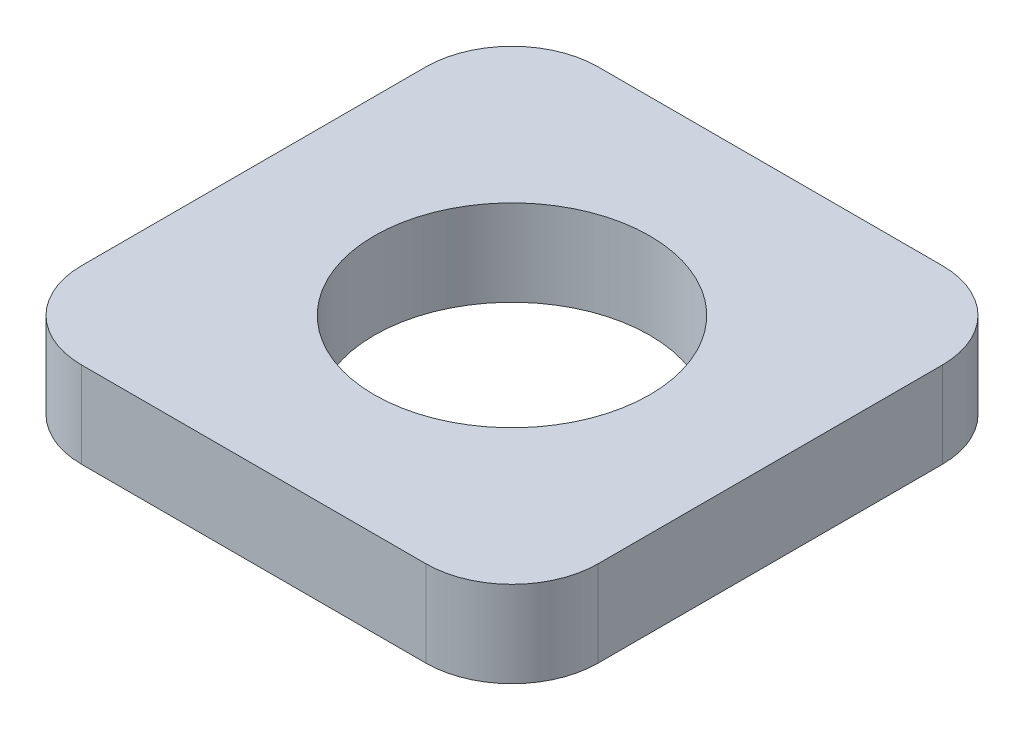
ISO-10303-21;
HEADER;
FILE_DESCRIPTION(('STEP AP214'),'2;1');
FILE_NAME('part.step','',(''),(''),'','','');
FILE_SCHEMA(('AUTOMOTIVE_DESIGN { 1 0 10303 214 1 1 1 1 }'));
ENDSEC;
DATA;
#1=APPLICATION_CONTEXT('core data for automotive mechanical design processes');
#2=APPLICATION_PROTOCOL_DEFINITION('international standard','automotive_design',2000,#1);
#3=PRODUCT_CONTEXT('',#1,'mechanical');
#4=PRODUCT('Part','Part','',(#3));
#5=PRODUCT_RELATED_PRODUCT_CATEGORY('part','',(#4));
#6=PRODUCT_DEFINITION_FORMATION('','',#4);
#7=PRODUCT_DEFINITION_CONTEXT('part definition',#1,'design');
#8=PRODUCT_DEFINITION('design','',#6,#7);
#9=PRODUCT_DEFINITION_SHAPE('','',#8);
#10=(LENGTH_UNIT() NAMED_UNIT(*) SI_UNIT(.MILLI.,.METRE.));
#11=(NAMED_UNIT(*) PLANE_ANGLE_UNIT() SI_UNIT($,.RADIAN.));
#12=(NAMED_UNIT(*) SI_UNIT($,.STERADIAN.) SOLID_ANGLE_UNIT());
#13=UNCERTAINTY_MEASURE_WITH_UNIT(LENGTH_MEASURE(1.E-05),#10,'distance_accuracy_value','');
#14=(GEOMETRIC_REPRESENTATION_CONTEXT(3) GLOBAL_UNCERTAINTY_ASSIGNED_CONTEXT((#13)) GLOBAL_UNIT_ASSIGNED_CONTEXT((#10,
#11,#12)) REPRESENTATION_CONTEXT('',''));
#15=CARTESIAN_POINT('',(0.,0.,0.));
#16=DIRECTION('',(0.,0.,1.));
#17=DIRECTION('',(1.,0.,0.));
#18=AXIS2_PLACEMENT_3D('',#15,#16,#17);
#19=CARTESIAN_POINT('',(2.,1.,-2.));
#20=DIRECTION('',(0.,1.,0.));
#21=DIRECTION('',(0.,0.,1.));
#22=AXIS2_PLACEMENT_3D('',#19,#20,#21);
#23=PLANE('',#22);
#24=CARTESIAN_POINT('',(2.,1.,-2.));
#25=DIRECTION('',(0.,1.,0.));
#26=DIRECTION('',(0.,0.,1.));
#27=AXIS2_PLACEMENT_3D('',#24,#25,#26);
#28=CIRCLE('',#27,1.);
#29=CARTESIAN_POINT('',(3.,1.,-2.));
#30=VERTEX_POINT('',#29);
#31=CARTESIAN_POINT('',(2.,1.,-3.));
#32=VERTEX_POINT('',#31);
#33=EDGE_CURVE('E145',#30,#32,#28,.T.);
#34=ORIENTED_EDGE('',*,*,#33,.T.);
#35=DIRECTION('',(-1.,0.,0.));
#36=VECTOR('',#35,1.);
#37=CARTESIAN_POINT('',(-2.,1.,-3.));
#38=LINE('',#37,#36);
#39=CARTESIAN_POINT('',(-2.,1.,-3.));
#40=VERTEX_POINT('',#39);
#41=EDGE_CURVE('E93',#32,#40,#38,.T.);
#42=ORIENTED_EDGE('',*,*,#41,.T.);
#43=CARTESIAN_POINT('',(-2.,1.,-2.));
#44=DIRECTION('',(0.,1.,0.));
#45=DIRECTION('',(0.,0.,1.));
#46=AXIS2_PLACEMENT_3D('',#43,#44,#45);
#47=CIRCLE('',#46,1.);
#48=CARTESIAN_POINT('',(-3.,1.,-2.));
#49=VERTEX_POINT('',#48);
#50=EDGE_CURVE('E160',#40,#49,#47,.T.);
#51=ORIENTED_EDGE('',*,*,#50,.T.);
#52=DIRECTION('',(0.,0.,1.));
#53=VECTOR('',#52,1.);
#54=CARTESIAN_POINT('',(-3.,1.,2.));
#55=LINE('',#54,#53);
#56=CARTESIAN_POINT('',(-3.,1.,2.));
#57=VERTEX_POINT('',#56);
#58=EDGE_CURVE('E173',#49,#57,#55,.T.);
#59=ORIENTED_EDGE('',*,*,#58,.T.);
#60=CARTESIAN_POINT('',(-2.,1.,2.));
#61=DIRECTION('',(0.,1.,0.));
#62=DIRECTION('',(0.,0.,-1.));
#63=AXIS2_PLACEMENT_3D('',#60,#61,#62);
#64=CIRCLE('',#63,1.);
#65=CARTESIAN_POINT('',(-2.,1.,3.));
#66=VERTEX_POINT('',#65);
#67=EDGE_CURVE('E112',#57,#66,#64,.T.);
#68=ORIENTED_EDGE('',*,*,#67,.T.);
#69=DIRECTION('',(1.,0.,0.));
#70=VECTOR('',#69,1.);
#71=CARTESIAN_POINT('',(-2.,1.,3.));
#72=LINE('',#71,#70);
#73=CARTESIAN_POINT('',(2.,1.,3.));
#74=VERTEX_POINT('',#73);
#75=EDGE_CURVE('E106',#66,#74,#72,.T.);
#76=ORIENTED_EDGE('',*,*,#75,.T.);
#77=CARTESIAN_POINT('',(2.,1.,2.));
#78=DIRECTION('',(0.,1.,0.));
#79=DIRECTION('',(0.,0.,-1.));
#80=AXIS2_PLACEMENT_3D('',#77,#78,#79);
#81=CIRCLE('',#80,1.);
#82=CARTESIAN_POINT('',(3.,1.,2.));
#83=VERTEX_POINT('',#82);
#84=EDGE_CURVE('E110',#74,#83,#81,.T.);
#85=ORIENTED_EDGE('',*,*,#84,.T.);
#86=DIRECTION('',(0.,0.,-1.));
#87=VECTOR('',#86,1.);
#88=CARTESIAN_POINT('',(3.,1.,2.));
#89=LINE('',#88,#87);
#90=EDGE_CURVE('E50',#83,#30,#89,.T.);
#91=ORIENTED_EDGE('',*,*,#90,.T.);
#92=EDGE_LOOP('',(#34,#42,#51,#59,#68,#76,#85,#91));
#93=FACE_BOUND('',#92,.T.);
#94=CARTESIAN_POINT('',(0.,1.,0.));
#95=DIRECTION('',(0.,1.,0.));
#96=DIRECTION('',(0.,0.,1.));
#97=AXIS2_PLACEMENT_3D('',#94,#95,#96);
#98=CIRCLE('',#97,1.6);
#99=CARTESIAN_POINT('',(0.,1.,1.6));
#100=VERTEX_POINT('',#99);
#101=EDGE_CURVE('E134',#100,#100,#98,.T.);
#102=ORIENTED_EDGE('',*,*,#101,.F.);
#103=EDGE_LOOP('',(#102));
#104=FACE_BOUND('',#103,.T.);
#105=ADVANCED_FACE('F33',(#93,#104),#23,.T.);
#106=CARTESIAN_POINT('',(2.,0.,-2.));
#107=DIRECTION('',(0.,1.,0.));
#108=DIRECTION('',(0.,0.,1.));
#109=AXIS2_PLACEMENT_3D('',#106,#107,#108);
#110=PLANE('',#109);
#111=CARTESIAN_POINT('',(2.,0.,-2.));
#112=DIRECTION('',(0.,1.,0.));
#113=DIRECTION('',(0.,0.,1.));
#114=AXIS2_PLACEMENT_3D('',#111,#112,#113);
#115=CIRCLE('',#114,1.);
#116=CARTESIAN_POINT('',(3.,0.,-2.));
#117=VERTEX_POINT('',#116);
#118=CARTESIAN_POINT('',(2.,0.,-3.));
#119=VERTEX_POINT('',#118);
#120=EDGE_CURVE('E130',#117,#119,#115,.T.);
#121=ORIENTED_EDGE('',*,*,#120,.F.);
#122=DIRECTION('',(0.,0.,-1.));
#123=VECTOR('',#122,1.);
#124=CARTESIAN_POINT('',(3.,0.,2.));
#125=LINE('',#124,#123);
#126=CARTESIAN_POINT('',(3.,0.,2.));
#127=VERTEX_POINT('',#126);
#128=EDGE_CURVE('E85',#127,#117,#125,.T.);
#129=ORIENTED_EDGE('',*,*,#128,.F.);
#130=CARTESIAN_POINT('',(2.,0.,2.));
#131=DIRECTION('',(0.,1.,0.));
#132=DIRECTION('',(0.,0.,-1.));
#133=AXIS2_PLACEMENT_3D('',#130,#131,#132);
#134=CIRCLE('',#133,1.);
#135=CARTESIAN_POINT('',(2.,0.,3.));
#136=VERTEX_POINT('',#135);
#137=EDGE_CURVE('E79',#136,#127,#134,.T.);
#138=ORIENTED_EDGE('',*,*,#137,.F.);
#139=DIRECTION('',(1.,0.,0.));
#140=VECTOR('',#139,1.);
#141=CARTESIAN_POINT('',(-2.,0.,3.));
#142=LINE('',#141,#140);
#143=CARTESIAN_POINT('',(-2.,0.,3.));
#144=VERTEX_POINT('',#143);
#145=EDGE_CURVE('E120',#144,#136,#142,.T.);
#146=ORIENTED_EDGE('',*,*,#145,.F.);
#147=CARTESIAN_POINT('',(-2.,0.,2.));
#148=DIRECTION('',(0.,1.,0.));
#149=DIRECTION('',(0.,0.,-1.));
#150=AXIS2_PLACEMENT_3D('',#147,#148,#149);
#151=CIRCLE('',#150,1.);
#152=CARTESIAN_POINT('',(-3.,0.,2.));
#153=VERTEX_POINT('',#152);
#154=EDGE_CURVE('E140',#153,#144,#151,.T.);
#155=ORIENTED_EDGE('',*,*,#154,.F.);
#156=DIRECTION('',(0.,0.,1.));
#157=VECTOR('',#156,1.);
#158=CARTESIAN_POINT('',(-3.,0.,2.));
#159=LINE('',#158,#157);
#160=CARTESIAN_POINT('',(-3.,0.,-2.));
#161=VERTEX_POINT('',#160);
#162=EDGE_CURVE('E138',#161,#153,#159,.T.);
#163=ORIENTED_EDGE('',*,*,#162,.F.);
#164=CARTESIAN_POINT('',(-2.,0.,-2.));
#165=DIRECTION('',(0.,1.,0.));
#166=DIRECTION('',(0.,0.,1.));
#167=AXIS2_PLACEMENT_3D('',#164,#165,#166);
#168=CIRCLE('',#167,1.);
#169=CARTESIAN_POINT('',(-2.,0.,-3.));
#170=VERTEX_POINT('',#169);
#171=EDGE_CURVE('E136',#170,#161,#168,.T.);
#172=ORIENTED_EDGE('',*,*,#171,.F.);
#173=DIRECTION('',(-1.,0.,0.));
#174=VECTOR('',#173,1.);
#175=CARTESIAN_POINT('',(-2.,0.,-3.));
#176=LINE('',#175,#174);
#177=EDGE_CURVE('E133',#119,#170,#176,.T.);
#178=ORIENTED_EDGE('',*,*,#177,.F.);
#179=EDGE_LOOP('',(#121,#129,#138,#146,#155,#163,#172,#178));
#180=FACE_BOUND('',#179,.T.);
#181=CARTESIAN_POINT('',(0.,0.,0.));
#182=DIRECTION('',(0.,1.,0.));
#183=DIRECTION('',(0.,0.,1.));
#184=AXIS2_PLACEMENT_3D('',#181,#182,#183);
#185=CIRCLE('',#184,1.6);
#186=CARTESIAN_POINT('',(0.,0.,1.6));
#187=VERTEX_POINT('',#186);
#188=EDGE_CURVE('E179',#187,#187,#185,.T.);
#189=ORIENTED_EDGE('',*,*,#188,.T.);
#190=EDGE_LOOP('',(#189));
#191=FACE_BOUND('',#190,.T.);
#192=ADVANCED_FACE('F164',(#180,#191),#110,.F.);
#193=CARTESIAN_POINT('',(2.,1.,-2.));
#194=DIRECTION('',(0.,-1.,0.));
#195=DIRECTION('',(0.,0.,-1.));
#196=AXIS2_PLACEMENT_3D('',#193,#194,#195);
#197=CYLINDRICAL_SURFACE('',#196,1.);
#198=ORIENTED_EDGE('',*,*,#120,.T.);
#199=DIRECTION('',(0.,-1.,0.));
#200=VECTOR('',#199,1.);
#201=CARTESIAN_POINT('',(2.,1.,-3.));
#202=LINE('',#201,#200);
#203=EDGE_CURVE('E11',#32,#119,#202,.T.);
#204=ORIENTED_EDGE('',*,*,#203,.F.);
#205=ORIENTED_EDGE('',*,*,#33,.F.);
#206=DIRECTION('',(0.,-1.,0.));
#207=VECTOR('',#206,1.);
#208=CARTESIAN_POINT('',(3.,1.,-2.));
#209=LINE('',#208,#207);
#210=EDGE_CURVE('E126',#30,#117,#209,.T.);
#211=ORIENTED_EDGE('',*,*,#210,.T.);
#212=EDGE_LOOP('',(#198,#204,#205,#211));
#213=FACE_BOUND('',#212,.T.);
#214=ADVANCED_FACE('F35',(#213),#197,.T.);
#215=CARTESIAN_POINT('',(-2.,1.,-3.));
#216=DIRECTION('',(0.,0.,1.));
#217=DIRECTION('',(1.,0.,0.));
#218=AXIS2_PLACEMENT_3D('',#215,#216,#217);
#219=PLANE('',#218);
#220=ORIENTED_EDGE('',*,*,#177,.T.);
#221=DIRECTION('',(0.,-1.,0.));
#222=VECTOR('',#221,1.);
#223=CARTESIAN_POINT('',(-2.,1.,-3.));
#224=LINE('',#223,#222);
#225=EDGE_CURVE('E42',#40,#170,#224,.T.);
#226=ORIENTED_EDGE('',*,*,#225,.F.);
#227=ORIENTED_EDGE('',*,*,#41,.F.);
#228=ORIENTED_EDGE('',*,*,#203,.T.);
#229=EDGE_LOOP('',(#220,#226,#227,#228));
#230=FACE_BOUND('',#229,.T.);
#231=ADVANCED_FACE('F207',(#230),#219,.F.);
#232=CARTESIAN_POINT('',(-2.,1.,-2.));
#233=DIRECTION('',(0.,-1.,0.));
#234=DIRECTION('',(0.,0.,-1.));
#235=AXIS2_PLACEMENT_3D('',#232,#233,#234);
#236=CYLINDRICAL_SURFACE('',#235,1.);
#237=ORIENTED_EDGE('',*,*,#171,.T.);
#238=DIRECTION('',(0.,-1.,0.));
#239=VECTOR('',#238,1.);
#240=CARTESIAN_POINT('',(-3.,1.,-2.));
#241=LINE('',#240,#239);
#242=EDGE_CURVE('E152',#49,#161,#241,.T.);
#243=ORIENTED_EDGE('',*,*,#242,.F.);
#244=ORIENTED_EDGE('',*,*,#50,.F.);
#245=ORIENTED_EDGE('',*,*,#225,.T.);
#246=EDGE_LOOP('',(#237,#243,#244,#245));
#247=FACE_BOUND('',#246,.T.);
#248=ADVANCED_FACE('F158',(#247),#236,.T.);
#249=CARTESIAN_POINT('',(-3.,1.,2.));
#250=DIRECTION('',(1.,0.,0.));
#251=DIRECTION('',(0.,0.,-1.));
#252=AXIS2_PLACEMENT_3D('',#249,#250,#251);
#253=PLANE('',#252);
#254=ORIENTED_EDGE('',*,*,#162,.T.);
#255=DIRECTION('',(0.,-1.,0.));
#256=VECTOR('',#255,1.);
#257=CARTESIAN_POINT('',(-3.,1.,2.));
#258=LINE('',#257,#256);
#259=EDGE_CURVE('E149',#57,#153,#258,.T.);
#260=ORIENTED_EDGE('',*,*,#259,.F.);
#261=ORIENTED_EDGE('',*,*,#58,.F.);
#262=ORIENTED_EDGE('',*,*,#242,.T.);
#263=EDGE_LOOP('',(#254,#260,#261,#262));
#264=FACE_BOUND('',#263,.T.);
#265=ADVANCED_FACE('F169',(#264),#253,.F.);
#266=CARTESIAN_POINT('',(-2.,1.,2.));
#267=DIRECTION('',(0.,-1.,0.));
#268=DIRECTION('',(0.,0.,-1.));
#269=AXIS2_PLACEMENT_3D('',#266,#267,#268);
#270=CYLINDRICAL_SURFACE('',#269,1.);
#271=ORIENTED_EDGE('',*,*,#154,.T.);
#272=DIRECTION('',(0.,-1.,0.));
#273=VECTOR('',#272,1.);
#274=CARTESIAN_POINT('',(-2.,1.,3.));
#275=LINE('',#274,#273);
#276=EDGE_CURVE('E121',#66,#144,#275,.T.);
#277=ORIENTED_EDGE('',*,*,#276,.F.);
#278=ORIENTED_EDGE('',*,*,#67,.F.);
#279=ORIENTED_EDGE('',*,*,#259,.T.);
#280=EDGE_LOOP('',(#271,#277,#278,#279));
#281=FACE_BOUND('',#280,.T.);
#282=ADVANCED_FACE('F172',(#281),#270,.T.);
#283=CARTESIAN_POINT('',(-2.,1.,3.));
#284=DIRECTION('',(0.,0.,-1.));
#285=DIRECTION('',(-1.,0.,0.));
#286=AXIS2_PLACEMENT_3D('',#283,#284,#285);
#287=PLANE('',#286);
#288=ORIENTED_EDGE('',*,*,#145,.T.);
#289=DIRECTION('',(0.,-1.,0.));
#290=VECTOR('',#289,1.);
#291=CARTESIAN_POINT('',(2.,1.,3.));
#292=LINE('',#291,#290);
#293=EDGE_CURVE('E117',#74,#136,#292,.T.);
#294=ORIENTED_EDGE('',*,*,#293,.F.);
#295=ORIENTED_EDGE('',*,*,#75,.F.);
#296=ORIENTED_EDGE('',*,*,#276,.T.);
#297=EDGE_LOOP('',(#288,#294,#295,#296));
#298=FACE_BOUND('',#297,.T.);
#299=ADVANCED_FACE('F118',(#298),#287,.F.);
#300=CARTESIAN_POINT('',(2.,1.,2.));
#301=DIRECTION('',(0.,-1.,0.));
#302=DIRECTION('',(0.,0.,-1.));
#303=AXIS2_PLACEMENT_3D('',#300,#301,#302);
#304=CYLINDRICAL_SURFACE('',#303,1.);
#305=ORIENTED_EDGE('',*,*,#137,.T.);
#306=DIRECTION('',(0.,-1.,0.));
#307=VECTOR('',#306,1.);
#308=CARTESIAN_POINT('',(3.,1.,2.));
#309=LINE('',#308,#307);
#310=EDGE_CURVE('E122',#83,#127,#309,.T.);
#311=ORIENTED_EDGE('',*,*,#310,.F.);
#312=ORIENTED_EDGE('',*,*,#84,.F.);
#313=ORIENTED_EDGE('',*,*,#293,.T.);
#314=EDGE_LOOP('',(#305,#311,#312,#313));
#315=FACE_BOUND('',#314,.T.);
#316=ADVANCED_FACE('F124',(#315),#304,.T.);
#317=CARTESIAN_POINT('',(3.,1.,2.));
#318=DIRECTION('',(-1.,0.,0.));
#319=DIRECTION('',(0.,0.,1.));
#320=AXIS2_PLACEMENT_3D('',#317,#318,#319);
#321=PLANE('',#320);
#322=ORIENTED_EDGE('',*,*,#128,.T.);
#323=ORIENTED_EDGE('',*,*,#210,.F.);
#324=ORIENTED_EDGE('',*,*,#90,.F.);
#325=ORIENTED_EDGE('',*,*,#310,.T.);
#326=EDGE_LOOP('',(#322,#323,#324,#325));
#327=FACE_BOUND('',#326,.T.);
#328=ADVANCED_FACE('F195',(#327),#321,.F.);
#329=CARTESIAN_POINT('',(0.,1.,0.));
#330=DIRECTION('',(0.,-1.,0.));
#331=DIRECTION('',(0.,0.,-1.));
#332=AXIS2_PLACEMENT_3D('',#329,#330,#331);
#333=CYLINDRICAL_SURFACE('',#332,1.6);
#334=ORIENTED_EDGE('',*,*,#101,.T.);
#335=EDGE_LOOP('',(#334));
#336=FACE_BOUND('',#335,.T.);
#337=ORIENTED_EDGE('',*,*,#188,.F.);
#338=EDGE_LOOP('',(#337));
#339=FACE_BOUND('',#338,.T.);
#340=ADVANCED_FACE('F185',(#336,#339),#333,.F.);
#341=CLOSED_SHELL('',(#105,#192,#214,#231,#248,#265,#282,#299,#316,#328,#340));
#342=MANIFOLD_SOLID_BREP('B2',#341);
#343=ADVANCED_BREP_SHAPE_REPRESENTATION('',(#18,#342),#14);
#344=SHAPE_DEFINITION_REPRESENTATION(#9,#343);
ENDSEC;
END-ISO-10303-21;
